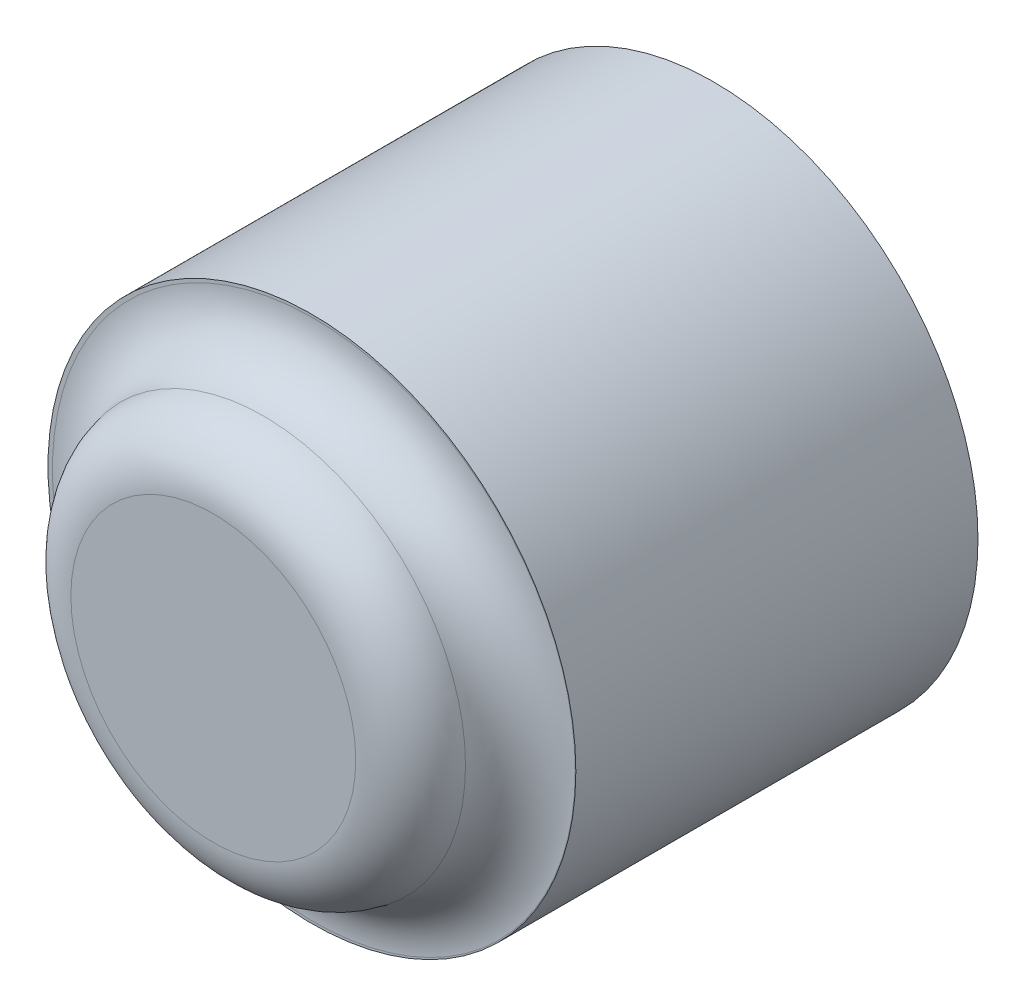
ISO-10303-21;
HEADER;
FILE_DESCRIPTION(('STEP AP214'),'2;1');
FILE_NAME('part.step','',(''),(''),'','','');
FILE_SCHEMA(('AUTOMOTIVE_DESIGN { 1 0 10303 214 1 1 1 1 }'));
ENDSEC;
DATA;
#1=APPLICATION_CONTEXT('core data for automotive mechanical design processes');
#2=APPLICATION_PROTOCOL_DEFINITION('international standard','automotive_design',2000,#1);
#3=PRODUCT_CONTEXT('',#1,'mechanical');
#4=PRODUCT('Part','Part','',(#3));
#5=PRODUCT_RELATED_PRODUCT_CATEGORY('part','',(#4));
#6=PRODUCT_DEFINITION_FORMATION('','',#4);
#7=PRODUCT_DEFINITION_CONTEXT('part definition',#1,'design');
#8=PRODUCT_DEFINITION('design','',#6,#7);
#9=PRODUCT_DEFINITION_SHAPE('','',#8);
#10=(LENGTH_UNIT() NAMED_UNIT(*) SI_UNIT(.MILLI.,.METRE.));
#11=(NAMED_UNIT(*) PLANE_ANGLE_UNIT() SI_UNIT($,.RADIAN.));
#12=(NAMED_UNIT(*) SI_UNIT($,.STERADIAN.) SOLID_ANGLE_UNIT());
#13=UNCERTAINTY_MEASURE_WITH_UNIT(LENGTH_MEASURE(1.E-05),#10,'distance_accuracy_value','');
#14=(GEOMETRIC_REPRESENTATION_CONTEXT(3) GLOBAL_UNCERTAINTY_ASSIGNED_CONTEXT((#13)) GLOBAL_UNIT_ASSIGNED_CONTEXT((#10,
#11,#12)) REPRESENTATION_CONTEXT('',''));
#15=CARTESIAN_POINT('',(0.,0.,0.));
#16=DIRECTION('',(0.,0.,1.));
#17=DIRECTION('',(1.,0.,0.));
#18=AXIS2_PLACEMENT_3D('',#15,#16,#17);
#19=CARTESIAN_POINT('',(0.0385515333425767,174.508746934659,9.2));
#20=DIRECTION('',(0.,0.,1.));
#21=DIRECTION('',(1.,0.,0.));
#22=AXIS2_PLACEMENT_3D('',#19,#20,#21);
#23=TOROIDAL_SURFACE('',#22,5.2,1.2);
#24=CARTESIAN_POINT('',(0.0385515333425767,174.508746934659,9.));
#25=DIRECTION('',(0.,0.,1.));
#26=DIRECTION('',(1.,0.,0.));
#27=AXIS2_PLACEMENT_3D('',#24,#25,#26);
#28=CIRCLE('',#27,4.01678404338007);
#29=CARTESIAN_POINT('',(4.05533557672265,174.508746934659,9.));
#30=VERTEX_POINT('',#29);
#31=EDGE_CURVE('E10',#30,#30,#28,.F.);
#32=ORIENTED_EDGE('',*,*,#31,.T.);
#33=EDGE_LOOP('',(#32));
#34=FACE_BOUND('',#33,.T.);
#35=CARTESIAN_POINT('',(0.0385515333425767,174.508746934659,8.));
#36=DIRECTION('',(0.,0.,1.));
#37=DIRECTION('',(1.,0.,0.));
#38=AXIS2_PLACEMENT_3D('',#35,#36,#37);
#39=CIRCLE('',#38,5.2);
#40=CARTESIAN_POINT('',(5.23855153334258,174.508746934659,8.));
#41=VERTEX_POINT('',#40);
#42=EDGE_CURVE('E45',#41,#41,#39,.F.);
#43=ORIENTED_EDGE('',*,*,#42,.F.);
#44=EDGE_LOOP('',(#43));
#45=FACE_BOUND('',#44,.T.);
#46=ADVANCED_FACE('F34',(#34,#45),#23,.F.);
#47=CARTESIAN_POINT('',(0.,174.508463829731,8.));
#48=DIRECTION('',(0.,0.,-1.));
#49=DIRECTION('',(-1.,0.,0.));
#50=AXIS2_PLACEMENT_3D('',#47,#48,#49);
#51=CYLINDRICAL_SURFACE('',#50,5.25);
#52=CARTESIAN_POINT('',(0.,174.508463829731,8.));
#53=DIRECTION('',(0.,0.,1.));
#54=DIRECTION('',(1.,0.,0.));
#55=AXIS2_PLACEMENT_3D('',#52,#53,#54);
#56=CIRCLE('',#55,5.25);
#57=CARTESIAN_POINT('',(5.25000000000003,174.508463829731,8.));
#58=VERTEX_POINT('',#57);
#59=EDGE_CURVE('E49',#58,#58,#56,.T.);
#60=ORIENTED_EDGE('',*,*,#59,.F.);
#61=EDGE_LOOP('',(#60));
#62=FACE_BOUND('',#61,.T.);
#63=CARTESIAN_POINT('',(0.,174.508463829731,0.));
#64=DIRECTION('',(0.,0.,1.));
#65=DIRECTION('',(1.,0.,0.));
#66=AXIS2_PLACEMENT_3D('',#63,#64,#65);
#67=CIRCLE('',#66,5.25);
#68=CARTESIAN_POINT('',(5.25000000000003,174.508463829731,0.));
#69=VERTEX_POINT('',#68);
#70=EDGE_CURVE('E52',#69,#69,#67,.T.);
#71=ORIENTED_EDGE('',*,*,#70,.T.);
#72=EDGE_LOOP('',(#71));
#73=FACE_BOUND('',#72,.T.);
#74=ADVANCED_FACE('F60',(#62,#73),#51,.T.);
#75=CARTESIAN_POINT('',(0.,174.508463829731,8.));
#76=DIRECTION('',(0.,0.,1.));
#77=DIRECTION('',(1.,0.,0.));
#78=AXIS2_PLACEMENT_3D('',#75,#76,#77);
#79=PLANE('',#78);
#80=ORIENTED_EDGE('',*,*,#42,.T.);
#81=EDGE_LOOP('',(#80));
#82=FACE_BOUND('',#81,.T.);
#83=ORIENTED_EDGE('',*,*,#59,.T.);
#84=EDGE_LOOP('',(#83));
#85=FACE_BOUND('',#84,.T.);
#86=ADVANCED_FACE('F58',(#82,#85),#79,.T.);
#87=CARTESIAN_POINT('',(0.,174.508463829731,0.));
#88=DIRECTION('',(0.,0.,1.));
#89=DIRECTION('',(1.,0.,0.));
#90=AXIS2_PLACEMENT_3D('',#87,#88,#89);
#91=PLANE('',#90);
#92=ORIENTED_EDGE('',*,*,#70,.F.);
#93=EDGE_LOOP('',(#92));
#94=FACE_BOUND('',#93,.T.);
#95=ADVANCED_FACE('F66',(#94),#91,.F.);
#96=CARTESIAN_POINT('',(0.0385515333425767,174.508746934659,10.));
#97=DIRECTION('',(0.,0.,1.));
#98=DIRECTION('',(1.,0.,0.));
#99=AXIS2_PLACEMENT_3D('',#96,#97,#98);
#100=PLANE('',#99);
#101=CARTESIAN_POINT('',(0.0385515333425767,174.508746934659,10.));
#102=DIRECTION('',(0.,0.,1.));
#103=DIRECTION('',(1.,0.,0.));
#104=AXIS2_PLACEMENT_3D('',#101,#102,#103);
#105=CIRCLE('',#104,2.83356808676015);
#106=CARTESIAN_POINT('',(2.87211962010273,174.508746934659,10.));
#107=VERTEX_POINT('',#106);
#108=EDGE_CURVE('E41',#107,#107,#105,.T.);
#109=ORIENTED_EDGE('',*,*,#108,.T.);
#110=EDGE_LOOP('',(#109));
#111=FACE_BOUND('',#110,.T.);
#112=ADVANCED_FACE('F68',(#111),#100,.T.);
#113=CARTESIAN_POINT('',(0.0385515333425767,174.508746934659,8.8));
#114=DIRECTION('',(0.,0.,-1.));
#115=DIRECTION('',(-1.,0.,0.));
#116=AXIS2_PLACEMENT_3D('',#113,#114,#115);
#117=TOROIDAL_SURFACE('',#116,2.83356808676015,1.2);
#118=ORIENTED_EDGE('',*,*,#31,.F.);
#119=EDGE_LOOP('',(#118));
#120=FACE_BOUND('',#119,.T.);
#121=ORIENTED_EDGE('',*,*,#108,.F.);
#122=EDGE_LOOP('',(#121));
#123=FACE_BOUND('',#122,.T.);
#124=ADVANCED_FACE('F36',(#120,#123),#117,.T.);
#125=CLOSED_SHELL('',(#46,#74,#86,#95,#112,#124));
#126=MANIFOLD_SOLID_BREP('B2',#125);
#127=ADVANCED_BREP_SHAPE_REPRESENTATION('',(#18,#126),#14);
#128=SHAPE_DEFINITION_REPRESENTATION(#9,#127);
ENDSEC;
END-ISO-10303-21;
